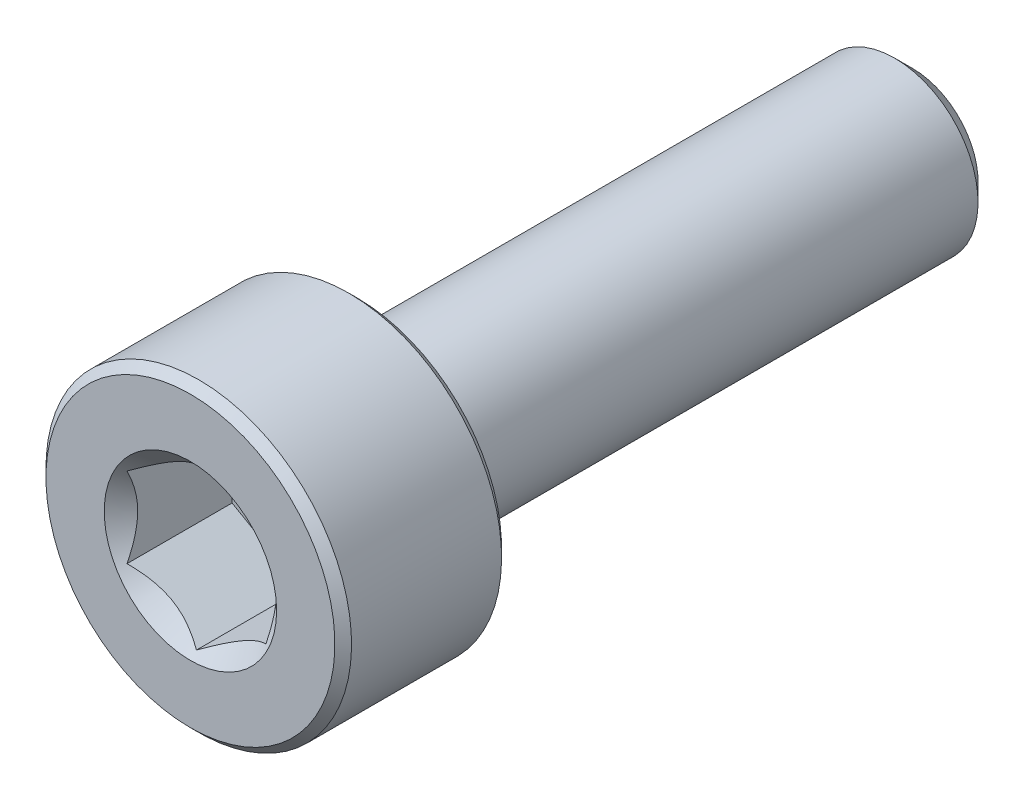
ISO-10303-21;
HEADER;
FILE_DESCRIPTION(('STEP AP214'),'2;1');
FILE_NAME('part.step','',(''),(''),'','','');
FILE_SCHEMA(('AUTOMOTIVE_DESIGN { 1 0 10303 214 1 1 1 1 }'));
ENDSEC;
DATA;
#1=APPLICATION_CONTEXT('core data for automotive mechanical design processes');
#2=APPLICATION_PROTOCOL_DEFINITION('international standard','automotive_design',2000,#1);
#3=PRODUCT_CONTEXT('',#1,'mechanical');
#4=PRODUCT('Part','Part','',(#3));
#5=PRODUCT_RELATED_PRODUCT_CATEGORY('part','',(#4));
#6=PRODUCT_DEFINITION_FORMATION('','',#4);
#7=PRODUCT_DEFINITION_CONTEXT('part definition',#1,'design');
#8=PRODUCT_DEFINITION('design','',#6,#7);
#9=PRODUCT_DEFINITION_SHAPE('','',#8);
#10=(LENGTH_UNIT() NAMED_UNIT(*) SI_UNIT(.MILLI.,.METRE.));
#11=(NAMED_UNIT(*) PLANE_ANGLE_UNIT() SI_UNIT($,.RADIAN.));
#12=(NAMED_UNIT(*) SI_UNIT($,.STERADIAN.) SOLID_ANGLE_UNIT());
#13=UNCERTAINTY_MEASURE_WITH_UNIT(LENGTH_MEASURE(1.E-05),#10,'distance_accuracy_value','');
#14=(GEOMETRIC_REPRESENTATION_CONTEXT(3) GLOBAL_UNCERTAINTY_ASSIGNED_CONTEXT((#13)) GLOBAL_UNIT_ASSIGNED_CONTEXT((#10,
#11,#12)) REPRESENTATION_CONTEXT('',''));
#15=CARTESIAN_POINT('',(0.,0.,0.));
#16=DIRECTION('',(0.,0.,1.));
#17=DIRECTION('',(1.,0.,0.));
#18=AXIS2_PLACEMENT_3D('',#15,#16,#17);
#19=CARTESIAN_POINT('',(0.,1.17524047358084,-6.5));
#20=DIRECTION('',(0.,0.,-1.));
#21=DIRECTION('',(0.,1.,0.));
#22=AXIS2_PLACEMENT_3D('',#19,#20,#21);
#23=PLANE('',#22);
#24=CARTESIAN_POINT('',(0.,0.,-6.5));
#25=DIRECTION('',(0.,0.,-1.));
#26=DIRECTION('',(0.,1.,0.));
#27=AXIS2_PLACEMENT_3D('',#24,#25,#26);
#28=CIRCLE('',#27,1.17524047358084);
#29=CARTESIAN_POINT('',(0.,1.17524047358084,-6.5));
#30=VERTEX_POINT('',#29);
#31=EDGE_CURVE('E59',#30,#30,#28,.T.);
#32=ORIENTED_EDGE('',*,*,#31,.T.);
#33=EDGE_LOOP('',(#32));
#34=FACE_BOUND('',#33,.T.);
#35=ADVANCED_FACE('F45',(#34),#23,.T.);
#36=CARTESIAN_POINT('',(0.,0.,-6.5));
#37=DIRECTION('',(0.,0.,1.));
#38=DIRECTION('',(0.,-1.,0.));
#39=AXIS2_PLACEMENT_3D('',#36,#37,#38);
#40=CONICAL_SURFACE('',#39,1.17524047358084,0.785398163397444);
#41=CARTESIAN_POINT('',(0.,0.,-6.17524047358083));
#42=DIRECTION('',(0.,0.,-1.));
#43=DIRECTION('',(0.,1.,0.));
#44=AXIS2_PLACEMENT_3D('',#41,#42,#43);
#45=CIRCLE('',#44,1.5);
#46=CARTESIAN_POINT('',(0.,1.5,-6.17524047358083));
#47=VERTEX_POINT('',#46);
#48=EDGE_CURVE('E177',#47,#47,#45,.T.);
#49=ORIENTED_EDGE('',*,*,#48,.T.);
#50=EDGE_LOOP('',(#49));
#51=FACE_BOUND('',#50,.T.);
#52=ORIENTED_EDGE('',*,*,#31,.F.);
#53=EDGE_LOOP('',(#52));
#54=FACE_BOUND('',#53,.T.);
#55=ADVANCED_FACE('F185',(#51,#54),#40,.T.);
#56=CARTESIAN_POINT('',(0.,0.,-6.5));
#57=DIRECTION('',(0.,0.,-1.));
#58=DIRECTION('',(0.,1.,0.));
#59=AXIS2_PLACEMENT_3D('',#56,#57,#58);
#60=CYLINDRICAL_SURFACE('',#59,1.5);
#61=CARTESIAN_POINT('',(0.,0.,3.35));
#62=DIRECTION('',(0.,0.,-1.));
#63=DIRECTION('',(0.,1.,0.));
#64=AXIS2_PLACEMENT_3D('',#61,#62,#63);
#65=CIRCLE('',#64,1.5);
#66=CARTESIAN_POINT('',(0.,1.5,3.35));
#67=VERTEX_POINT('',#66);
#68=EDGE_CURVE('E173',#67,#67,#65,.T.);
#69=ORIENTED_EDGE('',*,*,#68,.T.);
#70=EDGE_LOOP('',(#69));
#71=FACE_BOUND('',#70,.T.);
#72=ORIENTED_EDGE('',*,*,#48,.F.);
#73=EDGE_LOOP('',(#72));
#74=FACE_BOUND('',#73,.T.);
#75=ADVANCED_FACE('F187',(#71,#74),#60,.T.);
#76=CARTESIAN_POINT('',(0.,0.,3.35));
#77=DIRECTION('',(0.,0.,-1.));
#78=DIRECTION('',(0.,1.,0.));
#79=AXIS2_PLACEMENT_3D('',#76,#77,#78);
#80=TOROIDAL_SURFACE('',#79,1.65,0.15);
#81=CARTESIAN_POINT('',(0.,0.,3.5));
#82=DIRECTION('',(0.,0.,-1.));
#83=DIRECTION('',(0.,1.,0.));
#84=AXIS2_PLACEMENT_3D('',#81,#82,#83);
#85=CIRCLE('',#84,1.65);
#86=CARTESIAN_POINT('',(0.,1.65,3.5));
#87=VERTEX_POINT('',#86);
#88=EDGE_CURVE('E169',#87,#87,#85,.T.);
#89=ORIENTED_EDGE('',*,*,#88,.T.);
#90=EDGE_LOOP('',(#89));
#91=FACE_BOUND('',#90,.T.);
#92=ORIENTED_EDGE('',*,*,#68,.F.);
#93=EDGE_LOOP('',(#92));
#94=FACE_BOUND('',#93,.T.);
#95=ADVANCED_FACE('F193',(#91,#94),#80,.F.);
#96=CARTESIAN_POINT('',(0.,2.6,3.5));
#97=DIRECTION('',(0.,0.,-1.));
#98=DIRECTION('',(0.,1.,0.));
#99=AXIS2_PLACEMENT_3D('',#96,#97,#98);
#100=PLANE('',#99);
#101=CARTESIAN_POINT('',(0.,0.,3.5));
#102=DIRECTION('',(0.,0.,-1.));
#103=DIRECTION('',(0.,1.,0.));
#104=AXIS2_PLACEMENT_3D('',#101,#102,#103);
#105=CIRCLE('',#104,2.6);
#106=CARTESIAN_POINT('',(0.,2.6,3.5));
#107=VERTEX_POINT('',#106);
#108=EDGE_CURVE('E165',#107,#107,#105,.T.);
#109=ORIENTED_EDGE('',*,*,#108,.T.);
#110=EDGE_LOOP('',(#109));
#111=FACE_BOUND('',#110,.T.);
#112=ORIENTED_EDGE('',*,*,#88,.F.);
#113=EDGE_LOOP('',(#112));
#114=FACE_BOUND('',#113,.T.);
#115=ADVANCED_FACE('F199',(#111,#114),#100,.T.);
#116=CARTESIAN_POINT('',(0.,0.,3.5));
#117=DIRECTION('',(0.,0.,1.));
#118=DIRECTION('',(0.,-1.,0.));
#119=AXIS2_PLACEMENT_3D('',#116,#117,#118);
#120=CONICAL_SURFACE('',#119,2.6,0.785398163397445);
#121=CARTESIAN_POINT('',(0.,0.,3.65));
#122=DIRECTION('',(0.,0.,-1.));
#123=DIRECTION('',(0.,1.,0.));
#124=AXIS2_PLACEMENT_3D('',#121,#122,#123);
#125=CIRCLE('',#124,2.75);
#126=CARTESIAN_POINT('',(0.,2.75,3.65));
#127=VERTEX_POINT('',#126);
#128=EDGE_CURVE('E161',#127,#127,#125,.T.);
#129=ORIENTED_EDGE('',*,*,#128,.T.);
#130=EDGE_LOOP('',(#129));
#131=FACE_BOUND('',#130,.T.);
#132=ORIENTED_EDGE('',*,*,#108,.F.);
#133=EDGE_LOOP('',(#132));
#134=FACE_BOUND('',#133,.T.);
#135=ADVANCED_FACE('F203',(#131,#134),#120,.T.);
#136=CARTESIAN_POINT('',(0.,0.,-6.5));
#137=DIRECTION('',(0.,0.,-1.));
#138=DIRECTION('',(0.,1.,0.));
#139=AXIS2_PLACEMENT_3D('',#136,#137,#138);
#140=CYLINDRICAL_SURFACE('',#139,2.75);
#141=CARTESIAN_POINT('',(0.,0.,6.35));
#142=DIRECTION('',(0.,0.,-1.));
#143=DIRECTION('',(0.,1.,0.));
#144=AXIS2_PLACEMENT_3D('',#141,#142,#143);
#145=CIRCLE('',#144,2.75);
#146=CARTESIAN_POINT('',(0.,2.75,6.35));
#147=VERTEX_POINT('',#146);
#148=EDGE_CURVE('E157',#147,#147,#145,.T.);
#149=ORIENTED_EDGE('',*,*,#148,.T.);
#150=EDGE_LOOP('',(#149));
#151=FACE_BOUND('',#150,.T.);
#152=ORIENTED_EDGE('',*,*,#128,.F.);
#153=EDGE_LOOP('',(#152));
#154=FACE_BOUND('',#153,.T.);
#155=ADVANCED_FACE('F207',(#151,#154),#140,.T.);
#156=CARTESIAN_POINT('',(0.,0.,6.35));
#157=DIRECTION('',(0.,0.,-1.));
#158=DIRECTION('',(0.,1.,0.));
#159=AXIS2_PLACEMENT_3D('',#156,#157,#158);
#160=CONICAL_SURFACE('',#159,2.75,0.785398163397451);
#161=CARTESIAN_POINT('',(0.,0.,6.5));
#162=DIRECTION('',(0.,0.,-1.));
#163=DIRECTION('',(0.,1.,0.));
#164=AXIS2_PLACEMENT_3D('',#161,#162,#163);
#165=CIRCLE('',#164,2.6);
#166=CARTESIAN_POINT('',(0.,2.6,6.5));
#167=VERTEX_POINT('',#166);
#168=EDGE_CURVE('E153',#167,#167,#165,.T.);
#169=ORIENTED_EDGE('',*,*,#168,.T.);
#170=EDGE_LOOP('',(#169));
#171=FACE_BOUND('',#170,.T.);
#172=ORIENTED_EDGE('',*,*,#148,.F.);
#173=EDGE_LOOP('',(#172));
#174=FACE_BOUND('',#173,.T.);
#175=ADVANCED_FACE('F211',(#171,#174),#160,.T.);
#176=CARTESIAN_POINT('',(0.,0.,6.5));
#177=DIRECTION('',(0.,0.,1.));
#178=DIRECTION('',(0.,-1.,0.));
#179=AXIS2_PLACEMENT_3D('',#176,#177,#178);
#180=PLANE('',#179);
#181=CARTESIAN_POINT('',(0.,0.,6.5));
#182=DIRECTION('',(0.,0.,1.));
#183=DIRECTION('',(1.,0.,0.));
#184=AXIS2_PLACEMENT_3D('',#181,#182,#183);
#185=CIRCLE('',#184,1.55162884844712);
#186=CARTESIAN_POINT('',(1.55162884844712,0.,6.5));
#187=VERTEX_POINT('',#186);
#188=EDGE_CURVE('E119',#187,#187,#185,.T.);
#189=ORIENTED_EDGE('',*,*,#188,.F.);
#190=EDGE_LOOP('',(#189));
#191=FACE_BOUND('',#190,.T.);
#192=ORIENTED_EDGE('',*,*,#168,.F.);
#193=EDGE_LOOP('',(#192));
#194=FACE_BOUND('',#193,.T.);
#195=ADVANCED_FACE('F215',(#191,#194),#180,.T.);
#196=CARTESIAN_POINT('',(0.,0.,6.5));
#197=DIRECTION('',(0.,0.,1.));
#198=DIRECTION('',(1.,0.,0.));
#199=AXIS2_PLACEMENT_3D('',#196,#197,#198);
#200=CONICAL_SURFACE('',#199,1.55162884844712,0.78539816339745);
#201=ORIENTED_EDGE('',*,*,#188,.T.);
#202=EDGE_LOOP('',(#201));
#203=FACE_BOUND('',#202,.T.);
#204=CARTESIAN_POINT('',(-0.000199999999999347,-1.4434911430279,6.39186230843608));
#205=CARTESIAN_POINT('',(0.0427751670715874,-1.41867941875065,6.36706849258205));
#206=CARTESIAN_POINT('',(0.0864690047459488,-1.39345276980743,6.34373055894563));
#207=CARTESIAN_POINT('',(0.175565930841943,-1.34201263554194,6.30099882861148));
#208=CARTESIAN_POINT('',(0.220977498357065,-1.31579425481276,6.28162881688736));
#209=CARTESIAN_POINT('',(0.312547820935261,-1.26292610442246,6.24844730794042));
#210=CARTESIAN_POINT('',(0.358683240175886,-1.23628980770471,6.2345523835796));
#211=CARTESIAN_POINT('',(0.451970080407593,-1.18243062538508,6.21314410668758));
#212=CARTESIAN_POINT('',(0.499118649136381,-1.15520938653761,6.20561476609373));
#213=CARTESIAN_POINT('',(0.580373556887253,-1.10829684367467,6.19882132257765));
#214=CARTESIAN_POINT('',(0.614374876627942,-1.08866617256958,6.1978153836313));
#215=CARTESIAN_POINT('',(0.682317764432479,-1.04943932800611,6.19950823943826));
#216=CARTESIAN_POINT('',(0.716259317655659,-1.02984316311599,6.20220785174248));
#217=CARTESIAN_POINT('',(0.783814856457501,-0.990839954603499,6.21115575484332));
#218=CARTESIAN_POINT('',(0.817428507286776,-0.971433104248771,6.21740735042665));
#219=CARTESIAN_POINT('',(0.884094638217814,-0.932943395609905,6.23312250594085));
#220=CARTESIAN_POINT('',(0.917146871030297,-0.9138606800983,6.2425874446144));
#221=CARTESIAN_POINT('',(1.00179969160027,-0.864986351354567,6.27067821521453));
#222=CARTESIAN_POINT('',(1.05286649242964,-0.835502920149075,6.29141698197915));
#223=CARTESIAN_POINT('',(1.15300085411326,-0.777690319475908,6.33813395919842));
#224=CARTESIAN_POINT('',(1.20207431157827,-0.749357745598417,6.36409512047371));
#225=CARTESIAN_POINT('',(1.2502,-0.721572366433194,6.39186230843608));
#226=B_SPLINE_CURVE_WITH_KNOTS('',3,(#204,#205,#206,#207,#208,#209,#210,#211,#212,#213,#214,
#215,#216,#217,#218,#219,#220,#221,#222,#223,#224,#225),.UNSPECIFIED.,.F.,.F.,(4,2,2,2,2,2,2,2,
2,2,4),(0.,0.166533409618304,0.334037607289762,0.498880396489698,0.663307919240275,
0.780963963458827,0.898645970148454,1.01643764860773,1.1342799317155,1.32148652032141,
1.50809158792573),.UNSPECIFIED.);
#227=CARTESIAN_POINT('',(0.,-1.44337567297406,6.39174682452695));
#228=VERTEX_POINT('',#227);
#229=CARTESIAN_POINT('',(1.25,-0.721687836487032,6.39174682452694));
#230=VERTEX_POINT('',#229);
#231=EDGE_CURVE('E12',#228,#230,#226,.T.);
#232=ORIENTED_EDGE('',*,*,#231,.F.);
#233=CARTESIAN_POINT('',(-1.2502,-0.721572366433195,6.39186230843608));
#234=CARTESIAN_POINT('',(-1.20722483292841,-0.746384090710444,6.36706849258205));
#235=CARTESIAN_POINT('',(-1.16353099525405,-0.771610739653664,6.34373055894563));
#236=CARTESIAN_POINT('',(-1.07443406915806,-0.823050873919155,6.30099882861148));
#237=CARTESIAN_POINT('',(-1.02902250164294,-0.849269254648333,6.28162881688736));
#238=CARTESIAN_POINT('',(-0.93745217906474,-0.902137405038635,6.24844730794042));
#239=CARTESIAN_POINT('',(-0.891316759824114,-0.928773701756387,6.2345523835796));
#240=CARTESIAN_POINT('',(-0.798029919592408,-0.982632884076012,6.21314410668758));
#241=CARTESIAN_POINT('',(-0.75088135086362,-1.00985412292348,6.20561476609373));
#242=CARTESIAN_POINT('',(-0.669626443112748,-1.05676666578643,6.19882132257765));
#243=CARTESIAN_POINT('',(-0.635625123372059,-1.07639733689152,6.1978153836313));
#244=CARTESIAN_POINT('',(-0.567682235567523,-1.11562418145499,6.19950823943826));
#245=CARTESIAN_POINT('',(-0.533740682344343,-1.1352203463451,6.20220785174248));
#246=CARTESIAN_POINT('',(-0.466185143542501,-1.1742235548576,6.21115575484332));
#247=CARTESIAN_POINT('',(-0.432571492713225,-1.19363040521233,6.21740735042665));
#248=CARTESIAN_POINT('',(-0.365905361782187,-1.23212011385119,6.23312250594085));
#249=CARTESIAN_POINT('',(-0.332853128969705,-1.2512028293628,6.2425874446144));
#250=CARTESIAN_POINT('',(-0.248200308399736,-1.30007715810653,6.27067821521453));
#251=CARTESIAN_POINT('',(-0.197133507570362,-1.32956058931202,6.29141698197915));
#252=CARTESIAN_POINT('',(-0.0969991458867446,-1.38737318998519,6.33813395919842));
#253=CARTESIAN_POINT('',(-0.0479256884217298,-1.41570576386268,6.36409512047371));
#254=CARTESIAN_POINT('',(0.000200000000000719,-1.4434911430279,6.39186230843608));
#255=B_SPLINE_CURVE_WITH_KNOTS('',3,(#233,#234,#235,#236,#237,#238,#239,#240,#241,#242,#243,
#244,#245,#246,#247,#248,#249,#250,#251,#252,#253,#254),.UNSPECIFIED.,.F.,.F.,(4,2,2,2,2,2,2,2,
2,2,4),(0.,0.166533409618303,0.334037607289761,0.498880396489698,0.663307919240274,
0.780963963458826,0.898645970148452,1.01643764860773,1.13427993171549,1.32148652032141,
1.50809158792574),.UNSPECIFIED.);
#256=CARTESIAN_POINT('',(-1.25,-0.721687836487032,6.39174682452694));
#257=VERTEX_POINT('',#256);
#258=EDGE_CURVE('E104',#257,#228,#255,.T.);
#259=ORIENTED_EDGE('',*,*,#258,.F.);
#260=CARTESIAN_POINT('',(-1.25,-1.52022146239345,6.91651070319084));
#261=CARTESIAN_POINT('',(-1.25,-1.48354689134962,6.88818689718723));
#262=CARTESIAN_POINT('',(-1.25,-1.44667707589305,6.86011672093047));
#263=CARTESIAN_POINT('',(-1.25,-1.37246477804769,6.80459065501776));
#264=CARTESIAN_POINT('',(-1.25,-1.33512218721453,6.77713491044787));
#265=CARTESIAN_POINT('',(-1.25,-1.22171630832114,6.69545809771049));
#266=CARTESIAN_POINT('',(-1.25,-1.14482995781092,6.6423614251193));
#267=CARTESIAN_POINT('',(-1.25,-0.983056768942587,6.53734973416941));
#268=CARTESIAN_POINT('',(-1.25,-0.897974111811057,6.48573326925832));
#269=CARTESIAN_POINT('',(-1.25,-0.723462355215556,6.39078355108508));
#270=CARTESIAN_POINT('',(-1.25,-0.634049271919706,6.34742232185916));
#271=CARTESIAN_POINT('',(-1.25,-0.5005887711437,6.29435177040724));
#272=CARTESIAN_POINT('',(-1.25,-0.45869172620811,6.27926501327173));
#273=CARTESIAN_POINT('',(-1.25,-0.373815329706779,6.25244749770266));
#274=CARTESIAN_POINT('',(-1.25,-0.330835910419723,6.24071694982871));
#275=CARTESIAN_POINT('',(-1.25,-0.244810833071148,6.22144313304601));
#276=CARTESIAN_POINT('',(-1.25,-0.20178270746757,6.21382289169453));
#277=CARTESIAN_POINT('',(-1.25,-0.115176247984995,6.20293190707962));
#278=CARTESIAN_POINT('',(-1.25,-0.0715980347745597,6.1996602260857));
#279=CARTESIAN_POINT('',(-1.25,0.0136806197531966,6.19775210045869));
#280=CARTESIAN_POINT('',(-1.25,0.0553765370047047,6.19891205716704));
#281=CARTESIAN_POINT('',(-1.25,0.13844909645316,6.20533266388464));
#282=CARTESIAN_POINT('',(-1.25,0.179825709781942,6.21059368038276));
#283=CARTESIAN_POINT('',(-1.25,0.262662840763598,6.22500574721218));
#284=CARTESIAN_POINT('',(-1.25,0.304111120669651,6.23422600730023));
#285=CARTESIAN_POINT('',(-1.25,0.386089884230834,6.25604235623938));
#286=CARTESIAN_POINT('',(-1.25,0.426620414510369,6.26863827317792));
#287=CARTESIAN_POINT('',(-1.25,0.550794781768362,6.3120595916479));
#288=CARTESIAN_POINT('',(-1.25,0.632755591043412,6.34768282700966));
#289=CARTESIAN_POINT('',(-1.25,0.792852508946382,6.42696814455953));
#290=CARTESIAN_POINT('',(-1.25,0.870973935410876,6.47065844211049));
#291=CARTESIAN_POINT('',(-1.25,1.02031328199646,6.56088158787621));
#292=CARTESIAN_POINT('',(-1.25,1.09168171050215,6.60716845879521));
#293=CARTESIAN_POINT('',(-1.25,1.19682802849918,6.67876149953674));
#294=CARTESIAN_POINT('',(-1.25,1.2314248214359,6.70288582787532));
#295=CARTESIAN_POINT('',(-1.25,1.30014350643268,6.75178258410313));
#296=CARTESIAN_POINT('',(-1.25,1.33426552680451,6.7765548314612));
#297=CARTESIAN_POINT('',(-1.25,1.36818950249276,6.8015960474388));
#298=B_SPLINE_CURVE_WITH_KNOTS('',3,(#260,#261,#262,#263,#264,#265,#266,#267,#268,#269,#270,
#271,#272,#273,#274,#275,#276,#277,#278,#279,#280,#281,#282,#283,#284,#285,#286,#287,#288,#289,
#290,#291,#292,#293,#294,#295,#296,#297),.UNSPECIFIED.,.F.,.F.,(4,2,2,2,2,2,2,2,2,2,2,2,2,2,2,2,
2,2,4),(0.,0.139012369615044,0.278057225136918,0.558259504053771,0.856585057342475,
1.15388088887299,1.28736138903992,1.42085026158167,1.55174393609413,1.68260937990424,
1.80753647715252,1.93247473971975,2.05969207441603,2.18690293152764,2.45422704655832,
2.72250450232039,2.97756898823762,3.10409578574714,3.23058769667827),.UNSPECIFIED.);
#299=CARTESIAN_POINT('',(-1.25,0.721687836487032,6.39174682452694));
#300=VERTEX_POINT('',#299);
#301=EDGE_CURVE('E118',#300,#257,#298,.F.);
#302=ORIENTED_EDGE('',*,*,#301,.F.);
#303=CARTESIAN_POINT('',(0.000199999999999644,1.4434911430279,6.39186230843608));
#304=CARTESIAN_POINT('',(-0.0427751670715868,1.41867941875065,6.36706849258205));
#305=CARTESIAN_POINT('',(-0.0864690047459481,1.39345276980743,6.34373055894563));
#306=CARTESIAN_POINT('',(-0.175565930841942,1.34201263554194,6.30099882861148));
#307=CARTESIAN_POINT('',(-0.220977498357064,1.31579425481276,6.28162881688736));
#308=CARTESIAN_POINT('',(-0.312547820935259,1.26292610442246,6.24844730794042));
#309=CARTESIAN_POINT('',(-0.358683240175885,1.23628980770471,6.2345523835796));
#310=CARTESIAN_POINT('',(-0.451970080407592,1.18243062538508,6.21314410668758));
#311=CARTESIAN_POINT('',(-0.49911864913638,1.15520938653761,6.20561476609373));
#312=CARTESIAN_POINT('',(-0.580373556887252,1.10829684367467,6.19882132257765));
#313=CARTESIAN_POINT('',(-0.614374876627941,1.08866617256958,6.1978153836313));
#314=CARTESIAN_POINT('',(-0.682317764432477,1.04943932800611,6.19950823943826));
#315=CARTESIAN_POINT('',(-0.716259317655657,1.02984316311599,6.20220785174248));
#316=CARTESIAN_POINT('',(-0.783814856457499,0.990839954603499,6.21115575484332));
#317=CARTESIAN_POINT('',(-0.817428507286774,0.971433104248771,6.21740735042665));
#318=CARTESIAN_POINT('',(-0.884094638217813,0.932943395609905,6.23312250594085));
#319=CARTESIAN_POINT('',(-0.917146871030295,0.9138606800983,6.2425874446144));
#320=CARTESIAN_POINT('',(-1.00179969160026,0.864986351354567,6.27067821521453));
#321=CARTESIAN_POINT('',(-1.05286649242964,0.835502920149075,6.29141698197915));
#322=CARTESIAN_POINT('',(-1.15300085411325,0.777690319475908,6.33813395919842));
#323=CARTESIAN_POINT('',(-1.20207431157827,0.749357745598416,6.36409512047371));
#324=CARTESIAN_POINT('',(-1.2502,0.721572366433194,6.39186230843608));
#325=B_SPLINE_CURVE_WITH_KNOTS('',3,(#303,#304,#305,#306,#307,#308,#309,#310,#311,#312,#313,
#314,#315,#316,#317,#318,#319,#320,#321,#322,#323,#324),.UNSPECIFIED.,.F.,.F.,(4,2,2,2,2,2,2,2,
2,2,4),(0.,0.166533409618303,0.334037607289761,0.498880396489697,0.663307919240274,
0.780963963458826,0.898645970148452,1.01643764860773,1.13427993171549,1.32148652032141,
1.50809158792574),.UNSPECIFIED.);
#326=CARTESIAN_POINT('',(0.,1.44337567297406,6.39174682452694));
#327=VERTEX_POINT('',#326);
#328=EDGE_CURVE('E266',#327,#300,#325,.T.);
#329=ORIENTED_EDGE('',*,*,#328,.F.);
#330=CARTESIAN_POINT('',(1.2502,0.721572366433194,6.39186230843608));
#331=CARTESIAN_POINT('',(1.20722483292841,0.746384090710444,6.36706849258205));
#332=CARTESIAN_POINT('',(1.16353099525405,0.771610739653664,6.34373055894563));
#333=CARTESIAN_POINT('',(1.07443406915806,0.823050873919154,6.30099882861148));
#334=CARTESIAN_POINT('',(1.02902250164294,0.849269254648333,6.28162881688736));
#335=CARTESIAN_POINT('',(0.93745217906474,0.902137405038635,6.24844730794042));
#336=CARTESIAN_POINT('',(0.891316759824114,0.928773701756387,6.2345523835796));
#337=CARTESIAN_POINT('',(0.798029919592408,0.982632884076012,6.21314410668758));
#338=CARTESIAN_POINT('',(0.750881350863621,1.00985412292348,6.20561476609373));
#339=CARTESIAN_POINT('',(0.669626443112748,1.05676666578643,6.19882132257765));
#340=CARTESIAN_POINT('',(0.635625123372059,1.07639733689152,6.19781538363129));
#341=CARTESIAN_POINT('',(0.567682235567523,1.11562418145499,6.19950823943826));
#342=CARTESIAN_POINT('',(0.533740682344343,1.1352203463451,6.20220785174248));
#343=CARTESIAN_POINT('',(0.466185143542501,1.1742235548576,6.21115575484332));
#344=CARTESIAN_POINT('',(0.432571492713226,1.19363040521233,6.21740735042665));
#345=CARTESIAN_POINT('',(0.365905361782187,1.23212011385119,6.23312250594085));
#346=CARTESIAN_POINT('',(0.332853128969705,1.2512028293628,6.2425874446144));
#347=CARTESIAN_POINT('',(0.248200308399736,1.30007715810653,6.27067821521453));
#348=CARTESIAN_POINT('',(0.197133507570362,1.32956058931202,6.29141698197915));
#349=CARTESIAN_POINT('',(0.0969991458867456,1.38737318998519,6.33813395919842));
#350=CARTESIAN_POINT('',(0.0479256884217306,1.41570576386268,6.36409512047371));
#351=CARTESIAN_POINT('',(-0.000200000000000208,1.4434911430279,6.39186230843608));
#352=B_SPLINE_CURVE_WITH_KNOTS('',3,(#330,#331,#332,#333,#334,#335,#336,#337,#338,#339,#340,
#341,#342,#343,#344,#345,#346,#347,#348,#349,#350,#351),.UNSPECIFIED.,.F.,.F.,(4,2,2,2,2,2,2,2,
2,2,4),(0.,0.166533409618303,0.334037607289761,0.498880396489698,0.663307919240274,
0.780963963458826,0.898645970148452,1.01643764860773,1.13427993171549,1.32148652032141,
1.50809158792574),.UNSPECIFIED.);
#353=CARTESIAN_POINT('',(1.25,0.721687836487032,6.39174682452694));
#354=VERTEX_POINT('',#353);
#355=EDGE_CURVE('E239',#354,#327,#352,.T.);
#356=ORIENTED_EDGE('',*,*,#355,.F.);
#357=CARTESIAN_POINT('',(1.25,-1.52022146239345,6.91651070319084));
#358=CARTESIAN_POINT('',(1.25,-1.48354689134962,6.88818689718723));
#359=CARTESIAN_POINT('',(1.25,-1.44667707589305,6.86011672093047));
#360=CARTESIAN_POINT('',(1.25,-1.37246477804769,6.80459065501776));
#361=CARTESIAN_POINT('',(1.25,-1.33512218721453,6.77713491044787));
#362=CARTESIAN_POINT('',(1.25,-1.22171630832114,6.69545809771049));
#363=CARTESIAN_POINT('',(1.25,-1.14482995781092,6.6423614251193));
#364=CARTESIAN_POINT('',(1.25,-0.983056768942587,6.53734973416941));
#365=CARTESIAN_POINT('',(1.25,-0.897974111811057,6.48573326925832));
#366=CARTESIAN_POINT('',(1.25,-0.723462355215556,6.39078355108508));
#367=CARTESIAN_POINT('',(1.25,-0.634049271919706,6.34742232185916));
#368=CARTESIAN_POINT('',(1.25,-0.500588771143699,6.29435177040724));
#369=CARTESIAN_POINT('',(1.25,-0.45869172620811,6.27926501327173));
#370=CARTESIAN_POINT('',(1.25,-0.373815329706778,6.25244749770266));
#371=CARTESIAN_POINT('',(1.25,-0.330835910419723,6.24071694982871));
#372=CARTESIAN_POINT('',(1.25,-0.244810833071148,6.22144313304601));
#373=CARTESIAN_POINT('',(1.25,-0.20178270746757,6.21382289169453));
#374=CARTESIAN_POINT('',(1.25,-0.115176247984995,6.20293190707962));
#375=CARTESIAN_POINT('',(1.25,-0.0715980347745598,6.1996602260857));
#376=CARTESIAN_POINT('',(1.25,0.0136806197531965,6.19775210045869));
#377=CARTESIAN_POINT('',(1.25,0.0553765370047047,6.19891205716704));
#378=CARTESIAN_POINT('',(1.25,0.13844909645316,6.20533266388464));
#379=CARTESIAN_POINT('',(1.25,0.179825709781942,6.21059368038276));
#380=CARTESIAN_POINT('',(1.25,0.262662840763599,6.22500574721218));
#381=CARTESIAN_POINT('',(1.25,0.304111120669651,6.23422600730023));
#382=CARTESIAN_POINT('',(1.25,0.386089884230835,6.25604235623938));
#383=CARTESIAN_POINT('',(1.25,0.426620414510369,6.26863827317792));
#384=CARTESIAN_POINT('',(1.25,0.550794781768362,6.31205959164791));
#385=CARTESIAN_POINT('',(1.25,0.632755591043412,6.34768282700966));
#386=CARTESIAN_POINT('',(1.25,0.792852508946383,6.42696814455953));
#387=CARTESIAN_POINT('',(1.25,0.870973935410876,6.47065844211049));
#388=CARTESIAN_POINT('',(1.25,1.02031328199646,6.56088158787621));
#389=CARTESIAN_POINT('',(1.25,1.09168171050215,6.60716845879521));
#390=CARTESIAN_POINT('',(1.25,1.19682802849918,6.67876149953674));
#391=CARTESIAN_POINT('',(1.25,1.2314248214359,6.70288582787532));
#392=CARTESIAN_POINT('',(1.25,1.30014350643268,6.75178258410313));
#393=CARTESIAN_POINT('',(1.25,1.33426552680451,6.7765548314612));
#394=CARTESIAN_POINT('',(1.25,1.36818950249276,6.8015960474388));
#395=B_SPLINE_CURVE_WITH_KNOTS('',3,(#357,#358,#359,#360,#361,#362,#363,#364,#365,#366,#367,
#368,#369,#370,#371,#372,#373,#374,#375,#376,#377,#378,#379,#380,#381,#382,#383,#384,#385,#386,
#387,#388,#389,#390,#391,#392,#393,#394),.UNSPECIFIED.,.F.,.F.,(4,2,2,2,2,2,2,2,2,2,2,2,2,2,2,2,
2,2,4),(0.,0.139012369615044,0.278057225136918,0.558259504053771,0.856585057342474,
1.15388088887299,1.28736138903992,1.42085026158167,1.55174393609413,1.68260937990424,
1.80753647715252,1.93247473971975,2.05969207441603,2.18690293152764,2.45422704655832,
2.72250450232039,2.97756898823762,3.10409578574714,3.23058769667827),.UNSPECIFIED.);
#396=EDGE_CURVE('E66',#230,#354,#395,.T.);
#397=ORIENTED_EDGE('',*,*,#396,.F.);
#398=EDGE_LOOP('',(#232,#259,#302,#329,#356,#397));
#399=FACE_BOUND('',#398,.T.);
#400=ADVANCED_FACE('F103',(#203,#399),#200,.F.);
#401=CARTESIAN_POINT('',(0.,2.6,4.5));
#402=DIRECTION('',(0.,0.,-1.));
#403=DIRECTION('',(0.,1.,0.));
#404=AXIS2_PLACEMENT_3D('',#401,#402,#403);
#405=PLANE('',#404);
#406=DIRECTION('',(0.866025403784438,0.5,0.));
#407=VECTOR('',#406,1.);
#408=CARTESIAN_POINT('',(0.,-1.44337567297406,4.5));
#409=LINE('',#408,#407);
#410=CARTESIAN_POINT('',(0.,-1.44337567297406,4.5));
#411=VERTEX_POINT('',#410);
#412=CARTESIAN_POINT('',(1.25,-0.721687836487032,4.5));
#413=VERTEX_POINT('',#412);
#414=EDGE_CURVE('E122',#411,#413,#409,.T.);
#415=ORIENTED_EDGE('',*,*,#414,.T.);
#416=DIRECTION('',(0.,1.,0.));
#417=VECTOR('',#416,1.);
#418=CARTESIAN_POINT('',(1.25,-0.721687836487032,4.5));
#419=LINE('',#418,#417);
#420=CARTESIAN_POINT('',(1.25,0.721687836487032,4.5));
#421=VERTEX_POINT('',#420);
#422=EDGE_CURVE('E73',#413,#421,#419,.T.);
#423=ORIENTED_EDGE('',*,*,#422,.T.);
#424=DIRECTION('',(-0.866025403784439,0.5,0.));
#425=VECTOR('',#424,1.);
#426=CARTESIAN_POINT('',(1.25,0.721687836487032,4.5));
#427=LINE('',#426,#425);
#428=CARTESIAN_POINT('',(0.,1.44337567297406,4.5));
#429=VERTEX_POINT('',#428);
#430=EDGE_CURVE('E133',#421,#429,#427,.T.);
#431=ORIENTED_EDGE('',*,*,#430,.T.);
#432=DIRECTION('',(-0.866025403784439,-0.5,0.));
#433=VECTOR('',#432,1.);
#434=CARTESIAN_POINT('',(0.,1.44337567297406,4.5));
#435=LINE('',#434,#433);
#436=CARTESIAN_POINT('',(-1.25,0.721687836487032,4.5));
#437=VERTEX_POINT('',#436);
#438=EDGE_CURVE('E142',#429,#437,#435,.T.);
#439=ORIENTED_EDGE('',*,*,#438,.T.);
#440=DIRECTION('',(0.,-1.,0.));
#441=VECTOR('',#440,1.);
#442=CARTESIAN_POINT('',(-1.25,0.721687836487032,4.5));
#443=LINE('',#442,#441);
#444=CARTESIAN_POINT('',(-1.25,-0.721687836487033,4.5));
#445=VERTEX_POINT('',#444);
#446=EDGE_CURVE('E137',#437,#445,#443,.T.);
#447=ORIENTED_EDGE('',*,*,#446,.T.);
#448=DIRECTION('',(0.866025403784439,-0.5,0.));
#449=VECTOR('',#448,1.);
#450=CARTESIAN_POINT('',(-1.25,-0.721687836487032,4.5));
#451=LINE('',#450,#449);
#452=EDGE_CURVE('E124',#445,#411,#451,.T.);
#453=ORIENTED_EDGE('',*,*,#452,.T.);
#454=EDGE_LOOP('',(#415,#423,#431,#439,#447,#453));
#455=FACE_BOUND('',#454,.T.);
#456=ADVANCED_FACE('F220',(#455),#405,.F.);
#457=CARTESIAN_POINT('',(0.,-1.44337567297406,-0.318813079129867));
#458=DIRECTION('',(0.5,-0.866025403784438,0.));
#459=DIRECTION('',(0.866025403784438,0.5,0.));
#460=AXIS2_PLACEMENT_3D('',#457,#458,#459);
#461=PLANE('',#460);
#462=DIRECTION('',(0.,0.,1.));
#463=VECTOR('',#462,1.);
#464=CARTESIAN_POINT('',(0.,-1.44337567297406,-0.318813079129867));
#465=LINE('',#464,#463);
#466=EDGE_CURVE('E113',#411,#228,#465,.T.);
#467=ORIENTED_EDGE('',*,*,#466,.T.);
#468=ORIENTED_EDGE('',*,*,#231,.T.);
#469=DIRECTION('',(0.,0.,1.));
#470=VECTOR('',#469,1.);
#471=CARTESIAN_POINT('',(1.25,-0.721687836487032,-0.318813079129867));
#472=LINE('',#471,#470);
#473=EDGE_CURVE('E128',#413,#230,#472,.T.);
#474=ORIENTED_EDGE('',*,*,#473,.F.);
#475=ORIENTED_EDGE('',*,*,#414,.F.);
#476=EDGE_LOOP('',(#467,#468,#474,#475));
#477=FACE_BOUND('',#476,.T.);
#478=ADVANCED_FACE('F121',(#477),#461,.F.);
#479=CARTESIAN_POINT('',(-1.25,-0.721687836487032,-0.318813079129867));
#480=DIRECTION('',(-0.5,-0.866025403784439,0.));
#481=DIRECTION('',(0.866025403784439,-0.5,0.));
#482=AXIS2_PLACEMENT_3D('',#479,#480,#481);
#483=PLANE('',#482);
#484=DIRECTION('',(0.,0.,1.));
#485=VECTOR('',#484,1.);
#486=CARTESIAN_POINT('',(-1.25,-0.721687836487032,-0.318813079129867));
#487=LINE('',#486,#485);
#488=EDGE_CURVE('E116',#445,#257,#487,.T.);
#489=ORIENTED_EDGE('',*,*,#488,.T.);
#490=ORIENTED_EDGE('',*,*,#258,.T.);
#491=ORIENTED_EDGE('',*,*,#466,.F.);
#492=ORIENTED_EDGE('',*,*,#452,.F.);
#493=EDGE_LOOP('',(#489,#490,#491,#492));
#494=FACE_BOUND('',#493,.T.);
#495=ADVANCED_FACE('F112',(#494),#483,.F.);
#496=CARTESIAN_POINT('',(-1.25,0.721687836487032,-0.318813079129867));
#497=DIRECTION('',(-1.,0.,0.));
#498=DIRECTION('',(0.,0.,1.));
#499=AXIS2_PLACEMENT_3D('',#496,#497,#498);
#500=PLANE('',#499);
#501=DIRECTION('',(0.,0.,1.));
#502=VECTOR('',#501,1.);
#503=CARTESIAN_POINT('',(-1.25,0.721687836487032,-0.318813079129867));
#504=LINE('',#503,#502);
#505=EDGE_CURVE('E138',#437,#300,#504,.T.);
#506=ORIENTED_EDGE('',*,*,#505,.T.);
#507=ORIENTED_EDGE('',*,*,#301,.T.);
#508=ORIENTED_EDGE('',*,*,#488,.F.);
#509=ORIENTED_EDGE('',*,*,#446,.F.);
#510=EDGE_LOOP('',(#506,#507,#508,#509));
#511=FACE_BOUND('',#510,.T.);
#512=ADVANCED_FACE('F276',(#511),#500,.F.);
#513=CARTESIAN_POINT('',(0.,1.44337567297406,-0.318813079129867));
#514=DIRECTION('',(-0.5,0.866025403784438,0.));
#515=DIRECTION('',(-0.866025403784439,-0.5,0.));
#516=AXIS2_PLACEMENT_3D('',#513,#514,#515);
#517=PLANE('',#516);
#518=DIRECTION('',(0.,0.,1.));
#519=VECTOR('',#518,1.);
#520=CARTESIAN_POINT('',(0.,1.44337567297406,-0.318813079129867));
#521=LINE('',#520,#519);
#522=EDGE_CURVE('E143',#429,#327,#521,.T.);
#523=ORIENTED_EDGE('',*,*,#522,.T.);
#524=ORIENTED_EDGE('',*,*,#328,.T.);
#525=ORIENTED_EDGE('',*,*,#505,.F.);
#526=ORIENTED_EDGE('',*,*,#438,.F.);
#527=EDGE_LOOP('',(#523,#524,#525,#526));
#528=FACE_BOUND('',#527,.T.);
#529=ADVANCED_FACE('F273',(#528),#517,.F.);
#530=CARTESIAN_POINT('',(1.25,0.721687836487032,-0.318813079129867));
#531=DIRECTION('',(0.5,0.866025403784439,0.));
#532=DIRECTION('',(-0.866025403784439,0.5,0.));
#533=AXIS2_PLACEMENT_3D('',#530,#531,#532);
#534=PLANE('',#533);
#535=DIRECTION('',(0.,0.,1.));
#536=VECTOR('',#535,1.);
#537=CARTESIAN_POINT('',(1.25,0.721687836487032,-0.318813079129867));
#538=LINE('',#537,#536);
#539=EDGE_CURVE('E147',#421,#354,#538,.T.);
#540=ORIENTED_EDGE('',*,*,#539,.T.);
#541=ORIENTED_EDGE('',*,*,#355,.T.);
#542=ORIENTED_EDGE('',*,*,#522,.F.);
#543=ORIENTED_EDGE('',*,*,#430,.F.);
#544=EDGE_LOOP('',(#540,#541,#542,#543));
#545=FACE_BOUND('',#544,.T.);
#546=ADVANCED_FACE('F228',(#545),#534,.F.);
#547=CARTESIAN_POINT('',(1.25,-0.721687836487032,-0.318813079129867));
#548=DIRECTION('',(1.,0.,0.));
#549=DIRECTION('',(0.,0.,-1.));
#550=AXIS2_PLACEMENT_3D('',#547,#548,#549);
#551=PLANE('',#550);
#552=ORIENTED_EDGE('',*,*,#473,.T.);
#553=ORIENTED_EDGE('',*,*,#396,.T.);
#554=ORIENTED_EDGE('',*,*,#539,.F.);
#555=ORIENTED_EDGE('',*,*,#422,.F.);
#556=EDGE_LOOP('',(#552,#553,#554,#555));
#557=FACE_BOUND('',#556,.T.);
#558=ADVANCED_FACE('F224',(#557),#551,.F.);
#559=CLOSED_SHELL('',(#35,#55,#75,#95,#115,#135,#155,#175,#195,#400,#456,#478,#495,#512,#529,
#546,#558));
#560=MANIFOLD_SOLID_BREP('B2',#559);
#561=ADVANCED_BREP_SHAPE_REPRESENTATION('',(#18,#560),#14);
#562=SHAPE_DEFINITION_REPRESENTATION(#9,#561);
ENDSEC;
END-ISO-10303-21;
